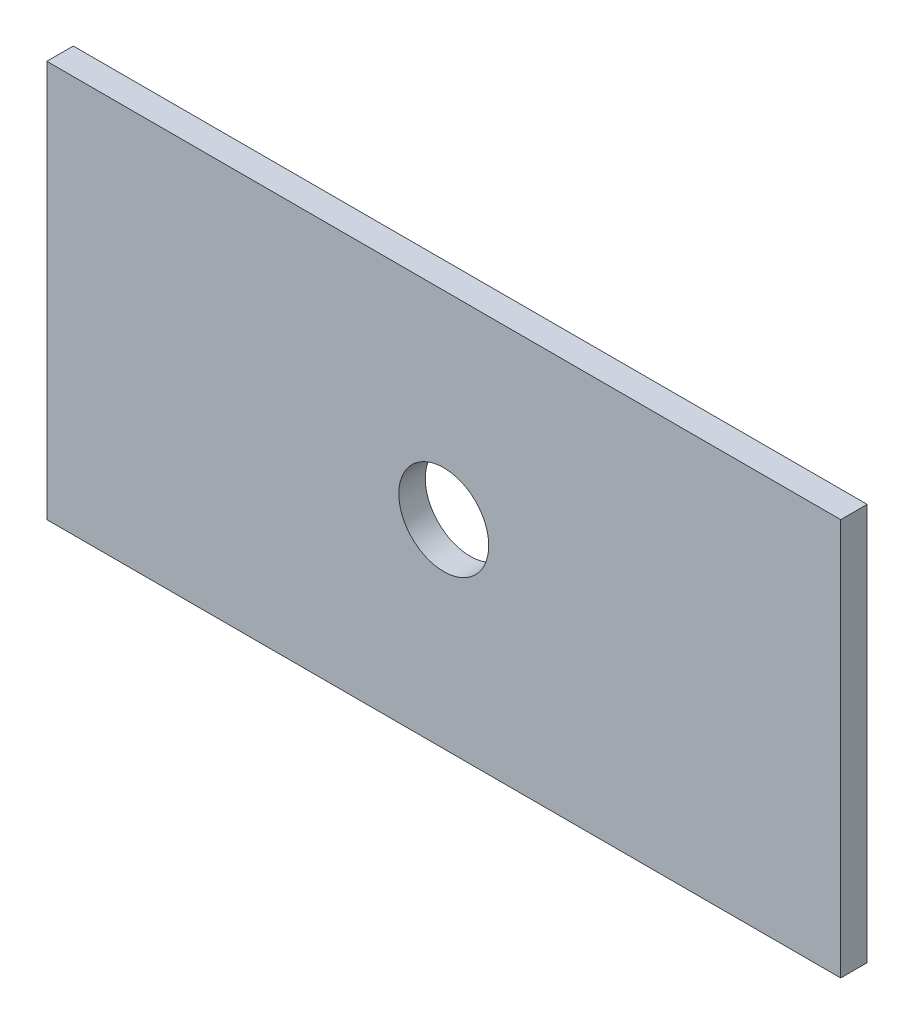
ISO-10303-21;
HEADER;
FILE_DESCRIPTION(('STEP AP214'),'2;1');
FILE_NAME('part.step','',(''),(''),'','','');
FILE_SCHEMA(('AUTOMOTIVE_DESIGN { 1 0 10303 214 1 1 1 1 }'));
ENDSEC;
DATA;
#1=APPLICATION_CONTEXT('core data for automotive mechanical design processes');
#2=APPLICATION_PROTOCOL_DEFINITION('international standard','automotive_design',2000,#1);
#3=PRODUCT_CONTEXT('',#1,'mechanical');
#4=PRODUCT('Part','Part','',(#3));
#5=PRODUCT_RELATED_PRODUCT_CATEGORY('part','',(#4));
#6=PRODUCT_DEFINITION_FORMATION('','',#4);
#7=PRODUCT_DEFINITION_CONTEXT('part definition',#1,'design');
#8=PRODUCT_DEFINITION('design','',#6,#7);
#9=PRODUCT_DEFINITION_SHAPE('','',#8);
#10=(LENGTH_UNIT() NAMED_UNIT(*) SI_UNIT(.MILLI.,.METRE.));
#11=(NAMED_UNIT(*) PLANE_ANGLE_UNIT() SI_UNIT($,.RADIAN.));
#12=(NAMED_UNIT(*) SI_UNIT($,.STERADIAN.) SOLID_ANGLE_UNIT());
#13=UNCERTAINTY_MEASURE_WITH_UNIT(LENGTH_MEASURE(1.E-05),#10,'distance_accuracy_value','');
#14=(GEOMETRIC_REPRESENTATION_CONTEXT(3) GLOBAL_UNCERTAINTY_ASSIGNED_CONTEXT((#13)) GLOBAL_UNIT_ASSIGNED_CONTEXT((#10,
#11,#12)) REPRESENTATION_CONTEXT('',''));
#15=CARTESIAN_POINT('',(0.,0.,0.));
#16=DIRECTION('',(0.,0.,1.));
#17=DIRECTION('',(1.,0.,0.));
#18=AXIS2_PLACEMENT_3D('',#15,#16,#17);
#19=CARTESIAN_POINT('',(0.,0.,1.));
#20=DIRECTION('',(1.,0.,0.));
#21=DIRECTION('',(0.,0.,-1.));
#22=AXIS2_PLACEMENT_3D('',#19,#20,#21);
#23=PLANE('',#22);
#24=DIRECTION('',(0.,-1.,0.));
#25=VECTOR('',#24,1.);
#26=CARTESIAN_POINT('',(0.,0.,0.));
#27=LINE('',#26,#25);
#28=CARTESIAN_POINT('',(0.,15.,0.));
#29=VERTEX_POINT('',#28);
#30=CARTESIAN_POINT('',(0.,0.,0.));
#31=VERTEX_POINT('',#30);
#32=EDGE_CURVE('E95',#29,#31,#27,.T.);
#33=ORIENTED_EDGE('',*,*,#32,.T.);
#34=DIRECTION('',(0.,0.,-1.));
#35=VECTOR('',#34,1.);
#36=CARTESIAN_POINT('',(0.,0.,1.));
#37=LINE('',#36,#35);
#38=CARTESIAN_POINT('',(0.,0.,1.));
#39=VERTEX_POINT('',#38);
#40=EDGE_CURVE('E11',#39,#31,#37,.T.);
#41=ORIENTED_EDGE('',*,*,#40,.F.);
#42=DIRECTION('',(0.,-1.,0.));
#43=VECTOR('',#42,1.);
#44=CARTESIAN_POINT('',(0.,0.,1.));
#45=LINE('',#44,#43);
#46=CARTESIAN_POINT('',(0.,15.,1.));
#47=VERTEX_POINT('',#46);
#48=EDGE_CURVE('E83',#47,#39,#45,.T.);
#49=ORIENTED_EDGE('',*,*,#48,.F.);
#50=DIRECTION('',(0.,0.,-1.));
#51=VECTOR('',#50,1.);
#52=CARTESIAN_POINT('',(0.,15.,1.));
#53=LINE('',#52,#51);
#54=EDGE_CURVE('E91',#47,#29,#53,.T.);
#55=ORIENTED_EDGE('',*,*,#54,.T.);
#56=EDGE_LOOP('',(#33,#41,#49,#55));
#57=FACE_BOUND('',#56,.T.);
#58=ADVANCED_FACE('F32',(#57),#23,.F.);
#59=CARTESIAN_POINT('',(0.,0.,1.));
#60=DIRECTION('',(0.,1.,0.));
#61=DIRECTION('',(0.,0.,1.));
#62=AXIS2_PLACEMENT_3D('',#59,#60,#61);
#63=PLANE('',#62);
#64=DIRECTION('',(1.,0.,0.));
#65=VECTOR('',#64,1.);
#66=CARTESIAN_POINT('',(0.,0.,0.));
#67=LINE('',#66,#65);
#68=CARTESIAN_POINT('',(30.,0.,0.));
#69=VERTEX_POINT('',#68);
#70=EDGE_CURVE('E87',#31,#69,#67,.T.);
#71=ORIENTED_EDGE('',*,*,#70,.T.);
#72=DIRECTION('',(0.,0.,-1.));
#73=VECTOR('',#72,1.);
#74=CARTESIAN_POINT('',(30.,0.,1.));
#75=LINE('',#74,#73);
#76=CARTESIAN_POINT('',(30.,0.,1.));
#77=VERTEX_POINT('',#76);
#78=EDGE_CURVE('E40',#77,#69,#75,.T.);
#79=ORIENTED_EDGE('',*,*,#78,.F.);
#80=DIRECTION('',(1.,0.,0.));
#81=VECTOR('',#80,1.);
#82=CARTESIAN_POINT('',(0.,0.,1.));
#83=LINE('',#82,#81);
#84=EDGE_CURVE('E78',#39,#77,#83,.T.);
#85=ORIENTED_EDGE('',*,*,#84,.F.);
#86=ORIENTED_EDGE('',*,*,#40,.T.);
#87=EDGE_LOOP('',(#71,#79,#85,#86));
#88=FACE_BOUND('',#87,.T.);
#89=ADVANCED_FACE('F86',(#88),#63,.F.);
#90=CARTESIAN_POINT('',(30.,0.,1.));
#91=DIRECTION('',(-1.,0.,0.));
#92=DIRECTION('',(0.,0.,1.));
#93=AXIS2_PLACEMENT_3D('',#90,#91,#92);
#94=PLANE('',#93);
#95=DIRECTION('',(0.,1.,0.));
#96=VECTOR('',#95,1.);
#97=CARTESIAN_POINT('',(30.,0.,0.));
#98=LINE('',#97,#96);
#99=CARTESIAN_POINT('',(30.,15.,0.));
#100=VERTEX_POINT('',#99);
#101=EDGE_CURVE('E65',#69,#100,#98,.T.);
#102=ORIENTED_EDGE('',*,*,#101,.T.);
#103=DIRECTION('',(0.,0.,-1.));
#104=VECTOR('',#103,1.);
#105=CARTESIAN_POINT('',(30.,15.,1.));
#106=LINE('',#105,#104);
#107=CARTESIAN_POINT('',(30.,15.,1.));
#108=VERTEX_POINT('',#107);
#109=EDGE_CURVE('E88',#108,#100,#106,.T.);
#110=ORIENTED_EDGE('',*,*,#109,.F.);
#111=DIRECTION('',(0.,1.,0.));
#112=VECTOR('',#111,1.);
#113=CARTESIAN_POINT('',(30.,0.,1.));
#114=LINE('',#113,#112);
#115=EDGE_CURVE('E81',#77,#108,#114,.T.);
#116=ORIENTED_EDGE('',*,*,#115,.F.);
#117=ORIENTED_EDGE('',*,*,#78,.T.);
#118=EDGE_LOOP('',(#102,#110,#116,#117));
#119=FACE_BOUND('',#118,.T.);
#120=ADVANCED_FACE('F89',(#119),#94,.F.);
#121=CARTESIAN_POINT('',(0.,15.,1.));
#122=DIRECTION('',(0.,-1.,0.));
#123=DIRECTION('',(0.,0.,-1.));
#124=AXIS2_PLACEMENT_3D('',#121,#122,#123);
#125=PLANE('',#124);
#126=DIRECTION('',(-1.,0.,0.));
#127=VECTOR('',#126,1.);
#128=CARTESIAN_POINT('',(0.,15.,0.));
#129=LINE('',#128,#127);
#130=EDGE_CURVE('E71',#100,#29,#129,.T.);
#131=ORIENTED_EDGE('',*,*,#130,.T.);
#132=ORIENTED_EDGE('',*,*,#54,.F.);
#133=DIRECTION('',(-1.,0.,0.));
#134=VECTOR('',#133,1.);
#135=CARTESIAN_POINT('',(0.,15.,1.));
#136=LINE('',#135,#134);
#137=EDGE_CURVE('E48',#108,#47,#136,.T.);
#138=ORIENTED_EDGE('',*,*,#137,.F.);
#139=ORIENTED_EDGE('',*,*,#109,.T.);
#140=EDGE_LOOP('',(#131,#132,#138,#139));
#141=FACE_BOUND('',#140,.T.);
#142=ADVANCED_FACE('F103',(#141),#125,.F.);
#143=CARTESIAN_POINT('',(0.,0.,1.));
#144=DIRECTION('',(0.,0.,-1.));
#145=DIRECTION('',(-1.,0.,0.));
#146=AXIS2_PLACEMENT_3D('',#143,#144,#145);
#147=PLANE('',#146);
#148=CARTESIAN_POINT('',(15.,7.5,1.));
#149=DIRECTION('',(0.,0.,-1.));
#150=DIRECTION('',(-1.,0.,0.));
#151=AXIS2_PLACEMENT_3D('',#148,#149,#150);
#152=CIRCLE('',#151,1.7);
#153=CARTESIAN_POINT('',(13.3,7.5,1.));
#154=VERTEX_POINT('',#153);
#155=EDGE_CURVE('E98',#154,#154,#152,.T.);
#156=ORIENTED_EDGE('',*,*,#155,.T.);
#157=EDGE_LOOP('',(#156));
#158=FACE_BOUND('',#157,.T.);
#159=ORIENTED_EDGE('',*,*,#48,.T.);
#160=ORIENTED_EDGE('',*,*,#84,.T.);
#161=ORIENTED_EDGE('',*,*,#115,.T.);
#162=ORIENTED_EDGE('',*,*,#137,.T.);
#163=EDGE_LOOP('',(#159,#160,#161,#162));
#164=FACE_BOUND('',#163,.T.);
#165=ADVANCED_FACE('F79',(#158,#164),#147,.F.);
#166=CARTESIAN_POINT('',(0.,0.,0.));
#167=DIRECTION('',(0.,0.,-1.));
#168=DIRECTION('',(-1.,0.,0.));
#169=AXIS2_PLACEMENT_3D('',#166,#167,#168);
#170=PLANE('',#169);
#171=CARTESIAN_POINT('',(15.,7.5,0.));
#172=DIRECTION('',(0.,0.,-1.));
#173=DIRECTION('',(-1.,0.,0.));
#174=AXIS2_PLACEMENT_3D('',#171,#172,#173);
#175=CIRCLE('',#174,1.69999999999999);
#176=CARTESIAN_POINT('',(13.3,7.5,0.));
#177=VERTEX_POINT('',#176);
#178=EDGE_CURVE('E111',#177,#177,#175,.T.);
#179=ORIENTED_EDGE('',*,*,#178,.F.);
#180=EDGE_LOOP('',(#179));
#181=FACE_BOUND('',#180,.T.);
#182=ORIENTED_EDGE('',*,*,#32,.F.);
#183=ORIENTED_EDGE('',*,*,#130,.F.);
#184=ORIENTED_EDGE('',*,*,#101,.F.);
#185=ORIENTED_EDGE('',*,*,#70,.F.);
#186=EDGE_LOOP('',(#182,#183,#184,#185));
#187=FACE_BOUND('',#186,.T.);
#188=ADVANCED_FACE('F106',(#181,#187),#170,.T.);
#189=CARTESIAN_POINT('',(15.,7.5,0.));
#190=DIRECTION('',(0.,0.,-1.));
#191=DIRECTION('',(-1.,0.,0.));
#192=AXIS2_PLACEMENT_3D('',#189,#190,#191);
#193=CYLINDRICAL_SURFACE('',#192,1.69999999999999);
#194=ORIENTED_EDGE('',*,*,#155,.F.);
#195=EDGE_LOOP('',(#194));
#196=FACE_BOUND('',#195,.T.);
#197=ORIENTED_EDGE('',*,*,#178,.T.);
#198=EDGE_LOOP('',(#197));
#199=FACE_BOUND('',#198,.T.);
#200=ADVANCED_FACE('F115',(#196,#199),#193,.F.);
#201=CLOSED_SHELL('',(#58,#89,#120,#142,#165,#188,#200));
#202=MANIFOLD_SOLID_BREP('B2',#201);
#203=ADVANCED_BREP_SHAPE_REPRESENTATION('',(#18,#202),#14);
#204=SHAPE_DEFINITION_REPRESENTATION(#9,#203);
ENDSEC;
END-ISO-10303-21;
